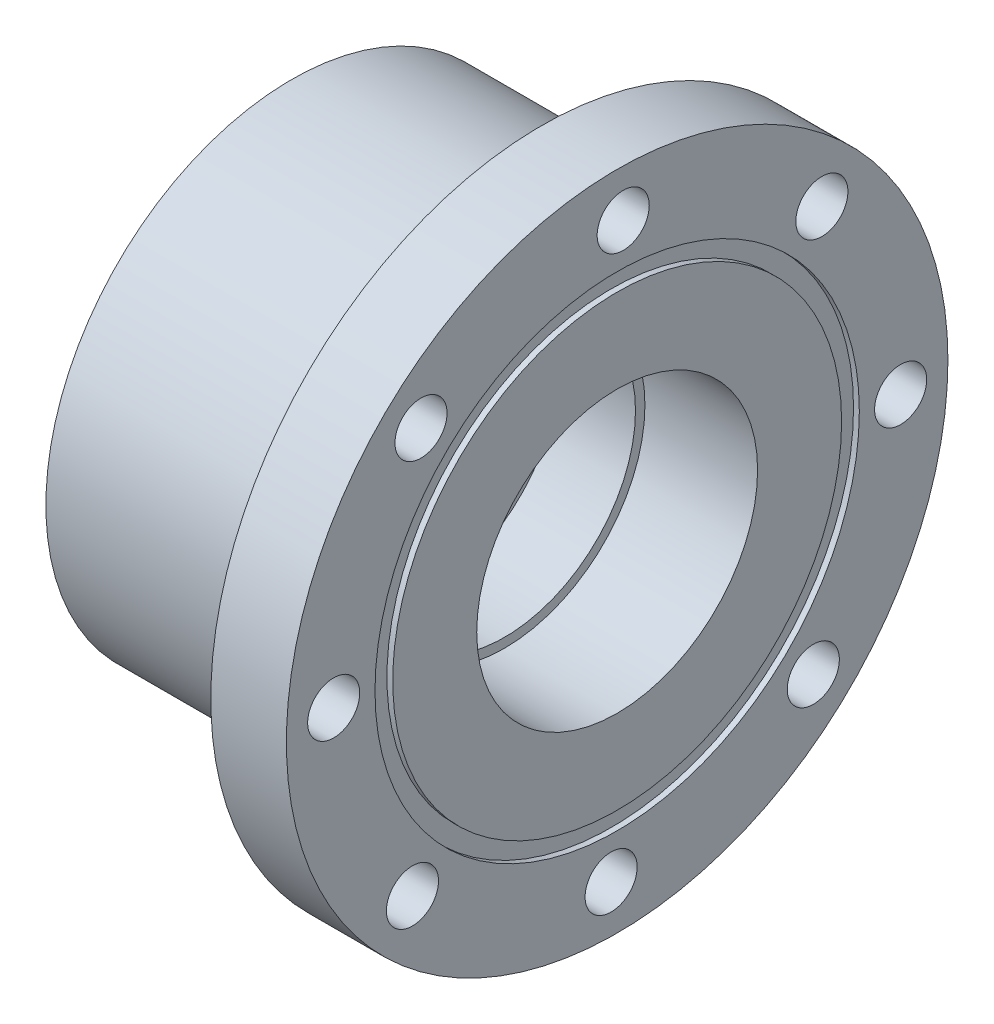
ISO-10303-21;
HEADER;
FILE_DESCRIPTION(('STEP AP214'),'2;1');
FILE_NAME('part.step','',(''),(''),'','','');
FILE_SCHEMA(('AUTOMOTIVE_DESIGN { 1 0 10303 214 1 1 1 1 }'));
ENDSEC;
DATA;
#1=APPLICATION_CONTEXT('core data for automotive mechanical design processes');
#2=APPLICATION_PROTOCOL_DEFINITION('international standard','automotive_design',2000,#1);
#3=PRODUCT_CONTEXT('',#1,'mechanical');
#4=PRODUCT('Part','Part','',(#3));
#5=PRODUCT_RELATED_PRODUCT_CATEGORY('part','',(#4));
#6=PRODUCT_DEFINITION_FORMATION('','',#4);
#7=PRODUCT_DEFINITION_CONTEXT('part definition',#1,'design');
#8=PRODUCT_DEFINITION('design','',#6,#7);
#9=PRODUCT_DEFINITION_SHAPE('','',#8);
#10=(LENGTH_UNIT() NAMED_UNIT(*) SI_UNIT(.MILLI.,.METRE.));
#11=(NAMED_UNIT(*) PLANE_ANGLE_UNIT() SI_UNIT($,.RADIAN.));
#12=(NAMED_UNIT(*) SI_UNIT($,.STERADIAN.) SOLID_ANGLE_UNIT());
#13=UNCERTAINTY_MEASURE_WITH_UNIT(LENGTH_MEASURE(1.E-05),#10,'distance_accuracy_value','');
#14=(GEOMETRIC_REPRESENTATION_CONTEXT(3) GLOBAL_UNCERTAINTY_ASSIGNED_CONTEXT((#13)) GLOBAL_UNIT_ASSIGNED_CONTEXT((#10,
#11,#12)) REPRESENTATION_CONTEXT('',''));
#15=CARTESIAN_POINT('',(0.,0.,0.));
#16=DIRECTION('',(0.,0.,1.));
#17=DIRECTION('',(1.,0.,0.));
#18=AXIS2_PLACEMENT_3D('',#15,#16,#17);
#19=CARTESIAN_POINT('',(71.9501138375944,0.,0.));
#20=DIRECTION('',(1.,0.,0.));
#21=DIRECTION('',(0.,0.,-1.));
#22=AXIS2_PLACEMENT_3D('',#19,#20,#21);
#23=CYLINDRICAL_SURFACE('',#22,8.500000018);
#24=CARTESIAN_POINT('',(6.34999999999999,0.,0.));
#25=DIRECTION('',(1.,0.,0.));
#26=DIRECTION('',(0.,0.,-1.));
#27=AXIS2_PLACEMENT_3D('',#24,#25,#26);
#28=CIRCLE('',#27,8.500000018);
#29=CARTESIAN_POINT('',(6.34999999999999,0.,-8.500000018));
#30=VERTEX_POINT('',#29);
#31=EDGE_CURVE('E89',#30,#30,#28,.T.);
#32=ORIENTED_EDGE('',*,*,#31,.T.);
#33=EDGE_LOOP('',(#32));
#34=FACE_BOUND('',#33,.T.);
#35=CARTESIAN_POINT('',(0.,0.,0.));
#36=DIRECTION('',(1.,0.,0.));
#37=DIRECTION('',(0.,0.,-1.));
#38=AXIS2_PLACEMENT_3D('',#35,#36,#37);
#39=CIRCLE('',#38,8.500000018);
#40=CARTESIAN_POINT('',(0.,0.,-8.500000018));
#41=VERTEX_POINT('',#40);
#42=EDGE_CURVE('E10',#41,#41,#39,.T.);
#43=ORIENTED_EDGE('',*,*,#42,.F.);
#44=EDGE_LOOP('',(#43));
#45=FACE_BOUND('',#44,.T.);
#46=ADVANCED_FACE('F37',(#34,#45),#23,.F.);
#47=CARTESIAN_POINT('',(0.,8.500000018,0.));
#48=DIRECTION('',(-1.,0.,0.));
#49=DIRECTION('',(0.,0.,1.));
#50=AXIS2_PLACEMENT_3D('',#47,#48,#49);
#51=PLANE('',#50);
#52=ORIENTED_EDGE('',*,*,#42,.T.);
#53=EDGE_LOOP('',(#52));
#54=FACE_BOUND('',#53,.T.);
#55=CARTESIAN_POINT('',(0.,0.,0.));
#56=DIRECTION('',(1.,0.,0.));
#57=DIRECTION('',(0.,0.,-1.));
#58=AXIS2_PLACEMENT_3D('',#55,#56,#57);
#59=CIRCLE('',#58,20.000000005);
#60=CARTESIAN_POINT('',(0.,0.,-20.000000005));
#61=VERTEX_POINT('',#60);
#62=EDGE_CURVE('E43',#61,#61,#59,.T.);
#63=ORIENTED_EDGE('',*,*,#62,.F.);
#64=EDGE_LOOP('',(#63));
#65=FACE_BOUND('',#64,.T.);
#66=ADVANCED_FACE('F217',(#54,#65),#51,.T.);
#67=CARTESIAN_POINT('',(71.9501138375944,0.,0.));
#68=DIRECTION('',(1.,0.,0.));
#69=DIRECTION('',(0.,0.,-1.));
#70=AXIS2_PLACEMENT_3D('',#67,#68,#69);
#71=CYLINDRICAL_SURFACE('',#70,20.000000005);
#72=ORIENTED_EDGE('',*,*,#62,.T.);
#73=EDGE_LOOP('',(#72));
#74=FACE_BOUND('',#73,.T.);
#75=CARTESIAN_POINT('',(-11.999999876,0.,0.));
#76=DIRECTION('',(1.,0.,0.));
#77=DIRECTION('',(0.,0.,-1.));
#78=AXIS2_PLACEMENT_3D('',#75,#76,#77);
#79=CIRCLE('',#78,20.000000005);
#80=CARTESIAN_POINT('',(-11.999999876,0.,-20.000000005));
#81=VERTEX_POINT('',#80);
#82=EDGE_CURVE('E47',#81,#81,#79,.T.);
#83=ORIENTED_EDGE('',*,*,#82,.F.);
#84=EDGE_LOOP('',(#83));
#85=FACE_BOUND('',#84,.T.);
#86=ADVANCED_FACE('F221',(#74,#85),#71,.F.);
#87=CARTESIAN_POINT('',(-11.999999876,20.000000005,0.));
#88=DIRECTION('',(-1.,0.,0.));
#89=DIRECTION('',(0.,0.,1.));
#90=AXIS2_PLACEMENT_3D('',#87,#88,#89);
#91=PLANE('',#90);
#92=ORIENTED_EDGE('',*,*,#82,.T.);
#93=EDGE_LOOP('',(#92));
#94=FACE_BOUND('',#93,.T.);
#95=CARTESIAN_POINT('',(-11.999999876,0.,0.));
#96=DIRECTION('',(1.,0.,0.));
#97=DIRECTION('',(0.,0.,-1.));
#98=AXIS2_PLACEMENT_3D('',#95,#96,#97);
#99=CIRCLE('',#98,33.02);
#100=CARTESIAN_POINT('',(-11.999999876,0.,-33.02));
#101=VERTEX_POINT('',#100);
#102=EDGE_CURVE('E51',#101,#101,#99,.T.);
#103=ORIENTED_EDGE('',*,*,#102,.F.);
#104=EDGE_LOOP('',(#103));
#105=FACE_BOUND('',#104,.T.);
#106=ADVANCED_FACE('F225',(#94,#105),#91,.T.);
#107=CARTESIAN_POINT('',(71.9501138375944,0.,0.));
#108=DIRECTION('',(1.,0.,0.));
#109=DIRECTION('',(0.,0.,-1.));
#110=AXIS2_PLACEMENT_3D('',#107,#108,#109);
#111=CYLINDRICAL_SURFACE('',#110,33.02);
#112=ORIENTED_EDGE('',*,*,#102,.T.);
#113=EDGE_LOOP('',(#112));
#114=FACE_BOUND('',#113,.T.);
#115=CARTESIAN_POINT('',(21.59,0.,0.));
#116=DIRECTION('',(1.,0.,0.));
#117=DIRECTION('',(0.,0.,-1.));
#118=AXIS2_PLACEMENT_3D('',#115,#116,#117);
#119=CIRCLE('',#118,33.02);
#120=CARTESIAN_POINT('',(21.59,0.,-33.02));
#121=VERTEX_POINT('',#120);
#122=EDGE_CURVE('E56',#121,#121,#119,.T.);
#123=ORIENTED_EDGE('',*,*,#122,.F.);
#124=EDGE_LOOP('',(#123));
#125=FACE_BOUND('',#124,.T.);
#126=ADVANCED_FACE('F231',(#114,#125),#111,.T.);
#127=CARTESIAN_POINT('',(21.59,33.02,0.));
#128=DIRECTION('',(-1.,0.,0.));
#129=DIRECTION('',(0.,0.,1.));
#130=AXIS2_PLACEMENT_3D('',#127,#128,#129);
#131=PLANE('',#130);
#132=CARTESIAN_POINT('',(21.59,0.813115256877907,38.0913224183545));
#133=DIRECTION('',(-1.,0.,0.));
#134=DIRECTION('',(0.,0.,1.));
#135=AXIS2_PLACEMENT_3D('',#132,#133,#134);
#136=CIRCLE('',#135,3.49999999999999);
#137=CARTESIAN_POINT('',(21.59,0.813115256877907,41.5913224183544));
#138=VERTEX_POINT('',#137);
#139=EDGE_CURVE('E134',#138,#138,#136,.T.);
#140=ORIENTED_EDGE('',*,*,#139,.F.);
#141=EDGE_LOOP('',(#140));
#142=FACE_BOUND('',#141,.T.);
#143=CARTESIAN_POINT('',(21.59,-26.359673074357,27.5095916984062));
#144=DIRECTION('',(-1.,0.,0.));
#145=DIRECTION('',(0.,0.,1.));
#146=AXIS2_PLACEMENT_3D('',#143,#144,#145);
#147=CIRCLE('',#146,3.49999999999999);
#148=CARTESIAN_POINT('',(21.59,-26.359673074357,31.0095916984062));
#149=VERTEX_POINT('',#148);
#150=EDGE_CURVE('E128',#149,#149,#147,.T.);
#151=ORIENTED_EDGE('',*,*,#150,.F.);
#152=EDGE_LOOP('',(#151));
#153=FACE_BOUND('',#152,.T.);
#154=CARTESIAN_POINT('',(21.59,-38.0913224183545,0.813115256877909));
#155=DIRECTION('',(-1.,0.,0.));
#156=DIRECTION('',(0.,0.,1.));
#157=AXIS2_PLACEMENT_3D('',#154,#155,#156);
#158=CIRCLE('',#157,3.49999999999999);
#159=CARTESIAN_POINT('',(21.59,-38.0913224183545,4.3131152568779));
#160=VERTEX_POINT('',#159);
#161=EDGE_CURVE('E122',#160,#160,#158,.T.);
#162=ORIENTED_EDGE('',*,*,#161,.F.);
#163=EDGE_LOOP('',(#162));
#164=FACE_BOUND('',#163,.T.);
#165=CARTESIAN_POINT('',(21.59,-27.5095916984062,-26.359673074357));
#166=DIRECTION('',(-1.,0.,0.));
#167=DIRECTION('',(0.,0.,1.));
#168=AXIS2_PLACEMENT_3D('',#165,#166,#167);
#169=CIRCLE('',#168,3.49999999999999);
#170=CARTESIAN_POINT('',(21.59,-27.5095916984062,-22.859673074357));
#171=VERTEX_POINT('',#170);
#172=EDGE_CURVE('E116',#171,#171,#169,.T.);
#173=ORIENTED_EDGE('',*,*,#172,.F.);
#174=EDGE_LOOP('',(#173));
#175=FACE_BOUND('',#174,.T.);
#176=CARTESIAN_POINT('',(21.59,-0.813115256877911,-38.0913224183545));
#177=DIRECTION('',(-1.,0.,0.));
#178=DIRECTION('',(0.,0.,1.));
#179=AXIS2_PLACEMENT_3D('',#176,#177,#178);
#180=CIRCLE('',#179,3.49999999999999);
#181=CARTESIAN_POINT('',(21.59,-0.813115256877911,-34.5913224183545));
#182=VERTEX_POINT('',#181);
#183=EDGE_CURVE('E110',#182,#182,#180,.T.);
#184=ORIENTED_EDGE('',*,*,#183,.F.);
#185=EDGE_LOOP('',(#184));
#186=FACE_BOUND('',#185,.T.);
#187=CARTESIAN_POINT('',(21.59,26.359673074357,-27.5095916984062));
#188=DIRECTION('',(-1.,0.,0.));
#189=DIRECTION('',(0.,0.,1.));
#190=AXIS2_PLACEMENT_3D('',#187,#188,#189);
#191=CIRCLE('',#190,3.49999999999999);
#192=CARTESIAN_POINT('',(21.59,26.359673074357,-24.0095916984062));
#193=VERTEX_POINT('',#192);
#194=EDGE_CURVE('E104',#193,#193,#191,.T.);
#195=ORIENTED_EDGE('',*,*,#194,.F.);
#196=EDGE_LOOP('',(#195));
#197=FACE_BOUND('',#196,.T.);
#198=CARTESIAN_POINT('',(21.59,38.0913224183545,-0.813115256877914));
#199=DIRECTION('',(-1.,0.,0.));
#200=DIRECTION('',(0.,0.,1.));
#201=AXIS2_PLACEMENT_3D('',#198,#199,#200);
#202=CIRCLE('',#201,3.49999999999999);
#203=CARTESIAN_POINT('',(21.59,38.0913224183545,2.68688474312208));
#204=VERTEX_POINT('',#203);
#205=EDGE_CURVE('E98',#204,#204,#202,.T.);
#206=ORIENTED_EDGE('',*,*,#205,.F.);
#207=EDGE_LOOP('',(#206));
#208=FACE_BOUND('',#207,.T.);
#209=CARTESIAN_POINT('',(21.59,27.5095916984062,26.359673074357));
#210=DIRECTION('',(-1.,0.,0.));
#211=DIRECTION('',(0.,0.,1.));
#212=AXIS2_PLACEMENT_3D('',#209,#210,#211);
#213=CIRCLE('',#212,3.49999999999999);
#214=CARTESIAN_POINT('',(21.59,27.5095916984062,29.859673074357));
#215=VERTEX_POINT('',#214);
#216=EDGE_CURVE('E92',#215,#215,#213,.T.);
#217=ORIENTED_EDGE('',*,*,#216,.F.);
#218=EDGE_LOOP('',(#217));
#219=FACE_BOUND('',#218,.T.);
#220=ORIENTED_EDGE('',*,*,#122,.T.);
#221=EDGE_LOOP('',(#220));
#222=FACE_BOUND('',#221,.T.);
#223=CARTESIAN_POINT('',(21.59,0.,0.));
#224=DIRECTION('',(1.,0.,0.));
#225=DIRECTION('',(0.,0.,-1.));
#226=AXIS2_PLACEMENT_3D('',#223,#224,#225);
#227=CIRCLE('',#226,44.45);
#228=CARTESIAN_POINT('',(21.59,0.,-44.45));
#229=VERTEX_POINT('',#228);
#230=EDGE_CURVE('E59',#229,#229,#227,.T.);
#231=ORIENTED_EDGE('',*,*,#230,.F.);
#232=EDGE_LOOP('',(#231));
#233=FACE_BOUND('',#232,.T.);
#234=ADVANCED_FACE('F235',(#142,#153,#164,#175,#186,#197,#208,#219,#222,#233),#131,.T.);
#235=CARTESIAN_POINT('',(71.9501138375944,0.,0.));
#236=DIRECTION('',(1.,0.,0.));
#237=DIRECTION('',(0.,0.,-1.));
#238=AXIS2_PLACEMENT_3D('',#235,#236,#237);
#239=CYLINDRICAL_SURFACE('',#238,44.45);
#240=ORIENTED_EDGE('',*,*,#230,.T.);
#241=EDGE_LOOP('',(#240));
#242=FACE_BOUND('',#241,.T.);
#243=CARTESIAN_POINT('',(31.75,0.,0.));
#244=DIRECTION('',(1.,0.,0.));
#245=DIRECTION('',(0.,0.,-1.));
#246=AXIS2_PLACEMENT_3D('',#243,#244,#245);
#247=CIRCLE('',#246,44.45);
#248=CARTESIAN_POINT('',(31.75,0.,-44.45));
#249=VERTEX_POINT('',#248);
#250=EDGE_CURVE('E62',#249,#249,#247,.T.);
#251=ORIENTED_EDGE('',*,*,#250,.F.);
#252=EDGE_LOOP('',(#251));
#253=FACE_BOUND('',#252,.T.);
#254=ADVANCED_FACE('F147',(#242,#253),#239,.T.);
#255=CARTESIAN_POINT('',(31.75,44.45,0.));
#256=DIRECTION('',(1.,0.,0.));
#257=DIRECTION('',(0.,0.,-1.));
#258=AXIS2_PLACEMENT_3D('',#255,#256,#257);
#259=PLANE('',#258);
#260=CARTESIAN_POINT('',(31.75,0.813115256877907,38.0913224183545));
#261=DIRECTION('',(1.,0.,0.));
#262=DIRECTION('',(0.,0.,-1.));
#263=AXIS2_PLACEMENT_3D('',#260,#261,#262);
#264=CIRCLE('',#263,3.49999999999999);
#265=CARTESIAN_POINT('',(31.75,0.813115256877907,34.5913224183545));
#266=VERTEX_POINT('',#265);
#267=EDGE_CURVE('E137',#266,#266,#264,.T.);
#268=ORIENTED_EDGE('',*,*,#267,.F.);
#269=EDGE_LOOP('',(#268));
#270=FACE_BOUND('',#269,.T.);
#271=CARTESIAN_POINT('',(31.75,-26.359673074357,27.5095916984062));
#272=DIRECTION('',(1.,0.,0.));
#273=DIRECTION('',(0.,0.,-1.));
#274=AXIS2_PLACEMENT_3D('',#271,#272,#273);
#275=CIRCLE('',#274,3.5);
#276=CARTESIAN_POINT('',(31.75,-26.359673074357,24.0095916984062));
#277=VERTEX_POINT('',#276);
#278=EDGE_CURVE('E131',#277,#277,#275,.T.);
#279=ORIENTED_EDGE('',*,*,#278,.F.);
#280=EDGE_LOOP('',(#279));
#281=FACE_BOUND('',#280,.T.);
#282=CARTESIAN_POINT('',(31.75,-38.0913224183545,0.813115256877909));
#283=DIRECTION('',(1.,0.,0.));
#284=DIRECTION('',(0.,0.,-1.));
#285=AXIS2_PLACEMENT_3D('',#282,#283,#284);
#286=CIRCLE('',#285,3.5);
#287=CARTESIAN_POINT('',(31.75,-38.0913224183545,-2.68688474312209));
#288=VERTEX_POINT('',#287);
#289=EDGE_CURVE('E125',#288,#288,#286,.T.);
#290=ORIENTED_EDGE('',*,*,#289,.F.);
#291=EDGE_LOOP('',(#290));
#292=FACE_BOUND('',#291,.T.);
#293=CARTESIAN_POINT('',(31.75,-27.5095916984062,-26.359673074357));
#294=DIRECTION('',(1.,0.,0.));
#295=DIRECTION('',(0.,0.,-1.));
#296=AXIS2_PLACEMENT_3D('',#293,#294,#295);
#297=CIRCLE('',#296,3.5);
#298=CARTESIAN_POINT('',(31.75,-27.5095916984062,-29.859673074357));
#299=VERTEX_POINT('',#298);
#300=EDGE_CURVE('E119',#299,#299,#297,.T.);
#301=ORIENTED_EDGE('',*,*,#300,.F.);
#302=EDGE_LOOP('',(#301));
#303=FACE_BOUND('',#302,.T.);
#304=CARTESIAN_POINT('',(31.75,-0.813115256877911,-38.0913224183545));
#305=DIRECTION('',(1.,0.,0.));
#306=DIRECTION('',(0.,0.,-1.));
#307=AXIS2_PLACEMENT_3D('',#304,#305,#306);
#308=CIRCLE('',#307,3.49999999999999);
#309=CARTESIAN_POINT('',(31.75,-0.813115256877911,-41.5913224183545));
#310=VERTEX_POINT('',#309);
#311=EDGE_CURVE('E113',#310,#310,#308,.T.);
#312=ORIENTED_EDGE('',*,*,#311,.F.);
#313=EDGE_LOOP('',(#312));
#314=FACE_BOUND('',#313,.T.);
#315=CARTESIAN_POINT('',(31.75,26.359673074357,-27.5095916984062));
#316=DIRECTION('',(1.,0.,0.));
#317=DIRECTION('',(0.,0.,-1.));
#318=AXIS2_PLACEMENT_3D('',#315,#316,#317);
#319=CIRCLE('',#318,3.5);
#320=CARTESIAN_POINT('',(31.75,26.359673074357,-31.0095916984062));
#321=VERTEX_POINT('',#320);
#322=EDGE_CURVE('E107',#321,#321,#319,.T.);
#323=ORIENTED_EDGE('',*,*,#322,.F.);
#324=EDGE_LOOP('',(#323));
#325=FACE_BOUND('',#324,.T.);
#326=CARTESIAN_POINT('',(31.75,38.0913224183545,-0.813115256877914));
#327=DIRECTION('',(1.,0.,0.));
#328=DIRECTION('',(0.,0.,-1.));
#329=AXIS2_PLACEMENT_3D('',#326,#327,#328);
#330=CIRCLE('',#329,3.5);
#331=CARTESIAN_POINT('',(31.75,38.0913224183545,-4.31311525687791));
#332=VERTEX_POINT('',#331);
#333=EDGE_CURVE('E101',#332,#332,#330,.T.);
#334=ORIENTED_EDGE('',*,*,#333,.F.);
#335=EDGE_LOOP('',(#334));
#336=FACE_BOUND('',#335,.T.);
#337=CARTESIAN_POINT('',(31.75,27.5095916984062,26.359673074357));
#338=DIRECTION('',(1.,0.,0.));
#339=DIRECTION('',(0.,0.,-1.));
#340=AXIS2_PLACEMENT_3D('',#337,#338,#339);
#341=CIRCLE('',#340,3.5);
#342=CARTESIAN_POINT('',(31.75,27.5095916984062,22.859673074357));
#343=VERTEX_POINT('',#342);
#344=EDGE_CURVE('E95',#343,#343,#341,.T.);
#345=ORIENTED_EDGE('',*,*,#344,.F.);
#346=EDGE_LOOP('',(#345));
#347=FACE_BOUND('',#346,.T.);
#348=ORIENTED_EDGE('',*,*,#250,.T.);
#349=EDGE_LOOP('',(#348));
#350=FACE_BOUND('',#349,.T.);
#351=CARTESIAN_POINT('',(31.75,0.,0.));
#352=DIRECTION('',(1.,0.,0.));
#353=DIRECTION('',(0.,0.,-1.));
#354=AXIS2_PLACEMENT_3D('',#351,#352,#353);
#355=CIRCLE('',#354,32.54375);
#356=CARTESIAN_POINT('',(31.75,0.,-32.54375));
#357=VERTEX_POINT('',#356);
#358=EDGE_CURVE('E65',#357,#357,#355,.T.);
#359=ORIENTED_EDGE('',*,*,#358,.F.);
#360=EDGE_LOOP('',(#359));
#361=FACE_BOUND('',#360,.T.);
#362=ADVANCED_FACE('F143',(#270,#281,#292,#303,#314,#325,#336,#347,#350,#361),#259,.T.);
#363=CARTESIAN_POINT('',(71.9501138375944,0.,0.));
#364=DIRECTION('',(1.,0.,0.));
#365=DIRECTION('',(0.,0.,-1.));
#366=AXIS2_PLACEMENT_3D('',#363,#364,#365);
#367=CYLINDRICAL_SURFACE('',#366,32.54375);
#368=ORIENTED_EDGE('',*,*,#358,.T.);
#369=EDGE_LOOP('',(#368));
#370=FACE_BOUND('',#369,.T.);
#371=CARTESIAN_POINT('',(30.972125,0.,0.));
#372=DIRECTION('',(1.,0.,0.));
#373=DIRECTION('',(0.,0.,-1.));
#374=AXIS2_PLACEMENT_3D('',#371,#372,#373);
#375=CIRCLE('',#374,32.54375);
#376=CARTESIAN_POINT('',(30.972125,0.,-32.54375));
#377=VERTEX_POINT('',#376);
#378=EDGE_CURVE('E68',#377,#377,#375,.T.);
#379=ORIENTED_EDGE('',*,*,#378,.F.);
#380=EDGE_LOOP('',(#379));
#381=FACE_BOUND('',#380,.T.);
#382=ADVANCED_FACE('F146',(#370,#381),#367,.F.);
#383=CARTESIAN_POINT('',(30.972125,32.54375,0.));
#384=DIRECTION('',(1.,0.,0.));
#385=DIRECTION('',(0.,0.,-1.));
#386=AXIS2_PLACEMENT_3D('',#383,#384,#385);
#387=PLANE('',#386);
#388=ORIENTED_EDGE('',*,*,#378,.T.);
#389=EDGE_LOOP('',(#388));
#390=FACE_BOUND('',#389,.T.);
#391=CARTESIAN_POINT('',(30.972125,0.,0.));
#392=DIRECTION('',(1.,0.,0.));
#393=DIRECTION('',(0.,0.,-1.));
#394=AXIS2_PLACEMENT_3D('',#391,#392,#393);
#395=CIRCLE('',#394,30.1625);
#396=CARTESIAN_POINT('',(30.972125,0.,-30.1625));
#397=VERTEX_POINT('',#396);
#398=EDGE_CURVE('E71',#397,#397,#395,.T.);
#399=ORIENTED_EDGE('',*,*,#398,.F.);
#400=EDGE_LOOP('',(#399));
#401=FACE_BOUND('',#400,.T.);
#402=ADVANCED_FACE('F169',(#390,#401),#387,.T.);
#403=CARTESIAN_POINT('',(71.9501138375944,0.,0.));
#404=DIRECTION('',(1.,0.,0.));
#405=DIRECTION('',(0.,0.,-1.));
#406=AXIS2_PLACEMENT_3D('',#403,#404,#405);
#407=CYLINDRICAL_SURFACE('',#406,30.1625);
#408=ORIENTED_EDGE('',*,*,#398,.T.);
#409=EDGE_LOOP('',(#408));
#410=FACE_BOUND('',#409,.T.);
#411=CARTESIAN_POINT('',(31.75,0.,0.));
#412=DIRECTION('',(1.,0.,0.));
#413=DIRECTION('',(0.,0.,-1.));
#414=AXIS2_PLACEMENT_3D('',#411,#412,#413);
#415=CIRCLE('',#414,30.1625);
#416=CARTESIAN_POINT('',(31.75,0.,-30.1625));
#417=VERTEX_POINT('',#416);
#418=EDGE_CURVE('E74',#417,#417,#415,.T.);
#419=ORIENTED_EDGE('',*,*,#418,.F.);
#420=EDGE_LOOP('',(#419));
#421=FACE_BOUND('',#420,.T.);
#422=ADVANCED_FACE('F175',(#410,#421),#407,.T.);
#423=CARTESIAN_POINT('',(31.75,30.1625,0.));
#424=DIRECTION('',(1.,0.,0.));
#425=DIRECTION('',(0.,0.,-1.));
#426=AXIS2_PLACEMENT_3D('',#423,#424,#425);
#427=PLANE('',#426);
#428=ORIENTED_EDGE('',*,*,#418,.T.);
#429=EDGE_LOOP('',(#428));
#430=FACE_BOUND('',#429,.T.);
#431=CARTESIAN_POINT('',(31.75,0.,0.));
#432=DIRECTION('',(1.,0.,0.));
#433=DIRECTION('',(0.,0.,-1.));
#434=AXIS2_PLACEMENT_3D('',#431,#432,#433);
#435=CIRCLE('',#434,18.8722);
#436=CARTESIAN_POINT('',(31.75,0.,-18.8722));
#437=VERTEX_POINT('',#436);
#438=EDGE_CURVE('E77',#437,#437,#435,.T.);
#439=ORIENTED_EDGE('',*,*,#438,.F.);
#440=EDGE_LOOP('',(#439));
#441=FACE_BOUND('',#440,.T.);
#442=ADVANCED_FACE('F181',(#430,#441),#427,.T.);
#443=CARTESIAN_POINT('',(71.9501138375944,0.,0.));
#444=DIRECTION('',(1.,0.,0.));
#445=DIRECTION('',(0.,0.,-1.));
#446=AXIS2_PLACEMENT_3D('',#443,#444,#445);
#447=CYLINDRICAL_SURFACE('',#446,18.8722);
#448=ORIENTED_EDGE('',*,*,#438,.T.);
#449=EDGE_LOOP('',(#448));
#450=FACE_BOUND('',#449,.T.);
#451=CARTESIAN_POINT('',(16.6116,0.,0.));
#452=DIRECTION('',(1.,0.,0.));
#453=DIRECTION('',(0.,0.,-1.));
#454=AXIS2_PLACEMENT_3D('',#451,#452,#453);
#455=CIRCLE('',#454,18.8722);
#456=CARTESIAN_POINT('',(16.6116,0.,-18.8722));
#457=VERTEX_POINT('',#456);
#458=EDGE_CURVE('E80',#457,#457,#455,.T.);
#459=ORIENTED_EDGE('',*,*,#458,.F.);
#460=EDGE_LOOP('',(#459));
#461=FACE_BOUND('',#460,.T.);
#462=ADVANCED_FACE('F187',(#450,#461),#447,.F.);
#463=CARTESIAN_POINT('',(16.6116,18.8722,0.));
#464=DIRECTION('',(1.,0.,0.));
#465=DIRECTION('',(0.,0.,-1.));
#466=AXIS2_PLACEMENT_3D('',#463,#464,#465);
#467=PLANE('',#466);
#468=ORIENTED_EDGE('',*,*,#458,.T.);
#469=EDGE_LOOP('',(#468));
#470=FACE_BOUND('',#469,.T.);
#471=CARTESIAN_POINT('',(16.6116,0.,0.));
#472=DIRECTION('',(1.,0.,0.));
#473=DIRECTION('',(0.,0.,-1.));
#474=AXIS2_PLACEMENT_3D('',#471,#472,#473);
#475=CIRCLE('',#474,17.6022);
#476=CARTESIAN_POINT('',(16.6116,0.,-17.6022));
#477=VERTEX_POINT('',#476);
#478=EDGE_CURVE('E83',#477,#477,#475,.T.);
#479=ORIENTED_EDGE('',*,*,#478,.F.);
#480=EDGE_LOOP('',(#479));
#481=FACE_BOUND('',#480,.T.);
#482=ADVANCED_FACE('F193',(#470,#481),#467,.T.);
#483=CARTESIAN_POINT('',(71.9501138375944,0.,0.));
#484=DIRECTION('',(1.,0.,0.));
#485=DIRECTION('',(0.,0.,-1.));
#486=AXIS2_PLACEMENT_3D('',#483,#484,#485);
#487=CYLINDRICAL_SURFACE('',#486,17.6022);
#488=ORIENTED_EDGE('',*,*,#478,.T.);
#489=EDGE_LOOP('',(#488));
#490=FACE_BOUND('',#489,.T.);
#491=CARTESIAN_POINT('',(6.34999999999999,0.,0.));
#492=DIRECTION('',(1.,0.,0.));
#493=DIRECTION('',(0.,0.,-1.));
#494=AXIS2_PLACEMENT_3D('',#491,#492,#493);
#495=CIRCLE('',#494,17.6022);
#496=CARTESIAN_POINT('',(6.34999999999999,0.,-17.6022));
#497=VERTEX_POINT('',#496);
#498=EDGE_CURVE('E86',#497,#497,#495,.T.);
#499=ORIENTED_EDGE('',*,*,#498,.F.);
#500=EDGE_LOOP('',(#499));
#501=FACE_BOUND('',#500,.T.);
#502=ADVANCED_FACE('F199',(#490,#501),#487,.F.);
#503=CARTESIAN_POINT('',(6.35,17.6022,0.));
#504=DIRECTION('',(1.,0.,0.));
#505=DIRECTION('',(0.,0.,-1.));
#506=AXIS2_PLACEMENT_3D('',#503,#504,#505);
#507=PLANE('',#506);
#508=ORIENTED_EDGE('',*,*,#498,.T.);
#509=EDGE_LOOP('',(#508));
#510=FACE_BOUND('',#509,.T.);
#511=ORIENTED_EDGE('',*,*,#31,.F.);
#512=EDGE_LOOP('',(#511));
#513=FACE_BOUND('',#512,.T.);
#514=ADVANCED_FACE('F205',(#510,#513),#507,.T.);
#515=CARTESIAN_POINT('',(31.75,27.5095916984062,26.359673074357));
#516=DIRECTION('',(1.,0.,0.));
#517=DIRECTION('',(0.,0.,-1.));
#518=AXIS2_PLACEMENT_3D('',#515,#516,#517);
#519=CYLINDRICAL_SURFACE('',#518,3.49999999999999);
#520=ORIENTED_EDGE('',*,*,#216,.T.);
#521=EDGE_LOOP('',(#520));
#522=FACE_BOUND('',#521,.T.);
#523=ORIENTED_EDGE('',*,*,#344,.T.);
#524=EDGE_LOOP('',(#523));
#525=FACE_BOUND('',#524,.T.);
#526=ADVANCED_FACE('F211',(#522,#525),#519,.F.);
#527=CARTESIAN_POINT('',(31.75,38.0913224183545,-0.813115256877914));
#528=DIRECTION('',(1.,0.,0.));
#529=DIRECTION('',(0.,0.,-1.));
#530=AXIS2_PLACEMENT_3D('',#527,#528,#529);
#531=CYLINDRICAL_SURFACE('',#530,3.49999999999999);
#532=ORIENTED_EDGE('',*,*,#205,.T.);
#533=EDGE_LOOP('',(#532));
#534=FACE_BOUND('',#533,.T.);
#535=ORIENTED_EDGE('',*,*,#333,.T.);
#536=EDGE_LOOP('',(#535));
#537=FACE_BOUND('',#536,.T.);
#538=ADVANCED_FACE('F245',(#534,#537),#531,.F.);
#539=CARTESIAN_POINT('',(31.75,26.359673074357,-27.5095916984062));
#540=DIRECTION('',(1.,0.,0.));
#541=DIRECTION('',(0.,0.,-1.));
#542=AXIS2_PLACEMENT_3D('',#539,#540,#541);
#543=CYLINDRICAL_SURFACE('',#542,3.49999999999999);
#544=ORIENTED_EDGE('',*,*,#194,.T.);
#545=EDGE_LOOP('',(#544));
#546=FACE_BOUND('',#545,.T.);
#547=ORIENTED_EDGE('',*,*,#322,.T.);
#548=EDGE_LOOP('',(#547));
#549=FACE_BOUND('',#548,.T.);
#550=ADVANCED_FACE('F249',(#546,#549),#543,.F.);
#551=CARTESIAN_POINT('',(31.75,-0.813115256877911,-38.0913224183545));
#552=DIRECTION('',(1.,0.,0.));
#553=DIRECTION('',(0.,0.,-1.));
#554=AXIS2_PLACEMENT_3D('',#551,#552,#553);
#555=CYLINDRICAL_SURFACE('',#554,3.49999999999999);
#556=ORIENTED_EDGE('',*,*,#183,.T.);
#557=EDGE_LOOP('',(#556));
#558=FACE_BOUND('',#557,.T.);
#559=ORIENTED_EDGE('',*,*,#311,.T.);
#560=EDGE_LOOP('',(#559));
#561=FACE_BOUND('',#560,.T.);
#562=ADVANCED_FACE('F253',(#558,#561),#555,.F.);
#563=CARTESIAN_POINT('',(31.75,-27.5095916984062,-26.359673074357));
#564=DIRECTION('',(1.,0.,0.));
#565=DIRECTION('',(0.,0.,-1.));
#566=AXIS2_PLACEMENT_3D('',#563,#564,#565);
#567=CYLINDRICAL_SURFACE('',#566,3.49999999999999);
#568=ORIENTED_EDGE('',*,*,#172,.T.);
#569=EDGE_LOOP('',(#568));
#570=FACE_BOUND('',#569,.T.);
#571=ORIENTED_EDGE('',*,*,#300,.T.);
#572=EDGE_LOOP('',(#571));
#573=FACE_BOUND('',#572,.T.);
#574=ADVANCED_FACE('F257',(#570,#573),#567,.F.);
#575=CARTESIAN_POINT('',(31.75,-38.0913224183545,0.813115256877909));
#576=DIRECTION('',(1.,0.,0.));
#577=DIRECTION('',(0.,0.,-1.));
#578=AXIS2_PLACEMENT_3D('',#575,#576,#577);
#579=CYLINDRICAL_SURFACE('',#578,3.49999999999999);
#580=ORIENTED_EDGE('',*,*,#161,.T.);
#581=EDGE_LOOP('',(#580));
#582=FACE_BOUND('',#581,.T.);
#583=ORIENTED_EDGE('',*,*,#289,.T.);
#584=EDGE_LOOP('',(#583));
#585=FACE_BOUND('',#584,.T.);
#586=ADVANCED_FACE('F261',(#582,#585),#579,.F.);
#587=CARTESIAN_POINT('',(31.75,-26.359673074357,27.5095916984062));
#588=DIRECTION('',(1.,0.,0.));
#589=DIRECTION('',(0.,0.,-1.));
#590=AXIS2_PLACEMENT_3D('',#587,#588,#589);
#591=CYLINDRICAL_SURFACE('',#590,3.49999999999999);
#592=ORIENTED_EDGE('',*,*,#150,.T.);
#593=EDGE_LOOP('',(#592));
#594=FACE_BOUND('',#593,.T.);
#595=ORIENTED_EDGE('',*,*,#278,.T.);
#596=EDGE_LOOP('',(#595));
#597=FACE_BOUND('',#596,.T.);
#598=ADVANCED_FACE('F265',(#594,#597),#591,.F.);
#599=CARTESIAN_POINT('',(31.75,0.813115256877907,38.0913224183545));
#600=DIRECTION('',(1.,0.,0.));
#601=DIRECTION('',(0.,0.,-1.));
#602=AXIS2_PLACEMENT_3D('',#599,#600,#601);
#603=CYLINDRICAL_SURFACE('',#602,3.49999999999999);
#604=ORIENTED_EDGE('',*,*,#139,.T.);
#605=EDGE_LOOP('',(#604));
#606=FACE_BOUND('',#605,.T.);
#607=ORIENTED_EDGE('',*,*,#267,.T.);
#608=EDGE_LOOP('',(#607));
#609=FACE_BOUND('',#608,.T.);
#610=ADVANCED_FACE('F141',(#606,#609),#603,.F.);
#611=CLOSED_SHELL('',(#46,#66,#86,#106,#126,#234,#254,#362,#382,#402,#422,#442,#462,#482,#502,
#514,#526,#538,#550,#562,#574,#586,#598,#610));
#612=MANIFOLD_SOLID_BREP('B2',#611);
#613=ADVANCED_BREP_SHAPE_REPRESENTATION('',(#18,#612),#14);
#614=SHAPE_DEFINITION_REPRESENTATION(#9,#613);
ENDSEC;
END-ISO-10303-21;
